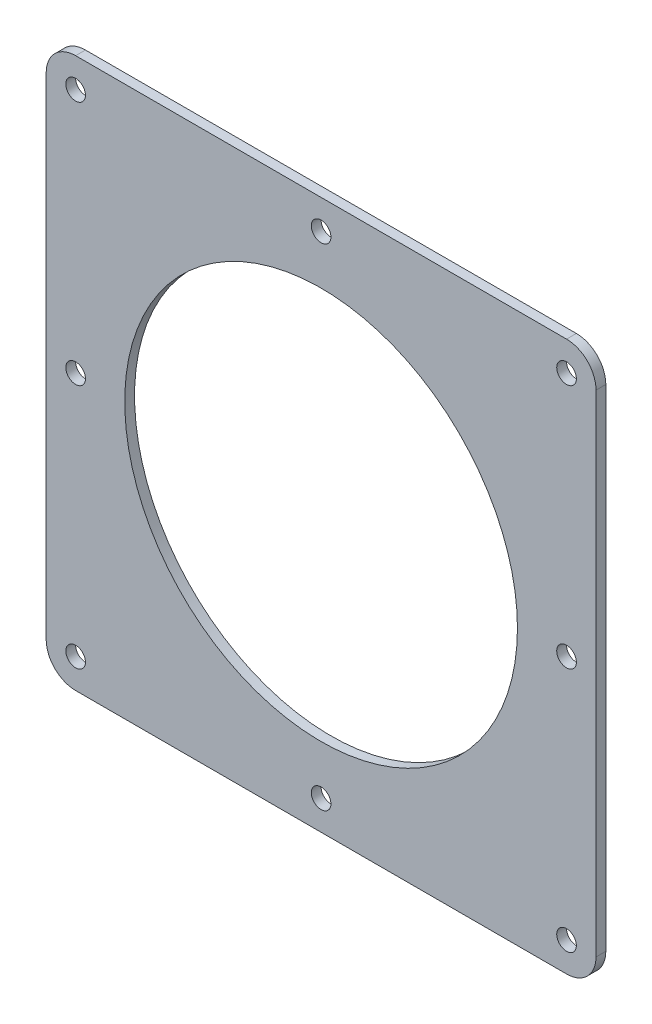
ISO-10303-21;
HEADER;
FILE_DESCRIPTION(('STEP AP214'),'2;1');
FILE_NAME('part.step','',(''),(''),'','','');
FILE_SCHEMA(('AUTOMOTIVE_DESIGN { 1 0 10303 214 1 1 1 1 }'));
ENDSEC;
DATA;
#1=APPLICATION_CONTEXT('core data for automotive mechanical design processes');
#2=APPLICATION_PROTOCOL_DEFINITION('international standard','automotive_design',2000,#1);
#3=PRODUCT_CONTEXT('',#1,'mechanical');
#4=PRODUCT('Part','Part','',(#3));
#5=PRODUCT_RELATED_PRODUCT_CATEGORY('part','',(#4));
#6=PRODUCT_DEFINITION_FORMATION('','',#4);
#7=PRODUCT_DEFINITION_CONTEXT('part definition',#1,'design');
#8=PRODUCT_DEFINITION('design','',#6,#7);
#9=PRODUCT_DEFINITION_SHAPE('','',#8);
#10=(LENGTH_UNIT() NAMED_UNIT(*) SI_UNIT(.MILLI.,.METRE.));
#11=(NAMED_UNIT(*) PLANE_ANGLE_UNIT() SI_UNIT($,.RADIAN.));
#12=(NAMED_UNIT(*) SI_UNIT($,.STERADIAN.) SOLID_ANGLE_UNIT());
#13=UNCERTAINTY_MEASURE_WITH_UNIT(LENGTH_MEASURE(1.E-05),#10,'distance_accuracy_value','');
#14=(GEOMETRIC_REPRESENTATION_CONTEXT(3) GLOBAL_UNCERTAINTY_ASSIGNED_CONTEXT((#13)) GLOBAL_UNIT_ASSIGNED_CONTEXT((#10,
#11,#12)) REPRESENTATION_CONTEXT('',''));
#15=CARTESIAN_POINT('',(0.,0.,0.));
#16=DIRECTION('',(0.,0.,1.));
#17=DIRECTION('',(1.,0.,0.));
#18=AXIS2_PLACEMENT_3D('',#15,#16,#17);
#19=CARTESIAN_POINT('',(-125.,-125.,5.));
#20=DIRECTION('',(0.,0.,1.));
#21=DIRECTION('',(1.,0.,0.));
#22=AXIS2_PLACEMENT_3D('',#19,#20,#21);
#23=PLANE('',#22);
#24=CARTESIAN_POINT('',(0.,0.,5.));
#25=DIRECTION('',(0.,0.,1.));
#26=DIRECTION('',(1.,0.,0.));
#27=AXIS2_PLACEMENT_3D('',#24,#25,#26);
#28=CIRCLE('',#27,100.);
#29=CARTESIAN_POINT('',(100.,0.,5.));
#30=VERTEX_POINT('',#29);
#31=EDGE_CURVE('E228',#30,#30,#28,.T.);
#32=ORIENTED_EDGE('',*,*,#31,.F.);
#33=EDGE_LOOP('',(#32));
#34=FACE_BOUND('',#33,.T.);
#35=CARTESIAN_POINT('',(0.,-125.,5.));
#36=DIRECTION('',(0.,0.,1.));
#37=DIRECTION('',(1.,0.,0.));
#38=AXIS2_PLACEMENT_3D('',#35,#36,#37);
#39=CIRCLE('',#38,5.);
#40=CARTESIAN_POINT('',(5.,-125.,5.));
#41=VERTEX_POINT('',#40);
#42=EDGE_CURVE('E214',#41,#41,#39,.T.);
#43=ORIENTED_EDGE('',*,*,#42,.F.);
#44=EDGE_LOOP('',(#43));
#45=FACE_BOUND('',#44,.T.);
#46=CARTESIAN_POINT('',(125.,0.,5.));
#47=DIRECTION('',(0.,0.,1.));
#48=DIRECTION('',(1.,0.,0.));
#49=AXIS2_PLACEMENT_3D('',#46,#47,#48);
#50=CIRCLE('',#49,5.00000000000001);
#51=CARTESIAN_POINT('',(130.,0.,5.));
#52=VERTEX_POINT('',#51);
#53=EDGE_CURVE('E196',#52,#52,#50,.T.);
#54=ORIENTED_EDGE('',*,*,#53,.F.);
#55=EDGE_LOOP('',(#54));
#56=FACE_BOUND('',#55,.T.);
#57=CARTESIAN_POINT('',(0.,125.,5.));
#58=DIRECTION('',(0.,0.,1.));
#59=DIRECTION('',(1.,0.,0.));
#60=AXIS2_PLACEMENT_3D('',#57,#58,#59);
#61=CIRCLE('',#60,5.);
#62=CARTESIAN_POINT('',(4.99999999999999,125.,5.));
#63=VERTEX_POINT('',#62);
#64=EDGE_CURVE('E184',#63,#63,#61,.T.);
#65=ORIENTED_EDGE('',*,*,#64,.F.);
#66=EDGE_LOOP('',(#65));
#67=FACE_BOUND('',#66,.T.);
#68=CARTESIAN_POINT('',(-125.,-125.,5.));
#69=DIRECTION('',(0.,0.,1.));
#70=DIRECTION('',(1.,0.,0.));
#71=AXIS2_PLACEMENT_3D('',#68,#69,#70);
#72=CIRCLE('',#71,15.);
#73=CARTESIAN_POINT('',(-140.,-125.,5.));
#74=VERTEX_POINT('',#73);
#75=CARTESIAN_POINT('',(-125.,-140.,5.));
#76=VERTEX_POINT('',#75);
#77=EDGE_CURVE('E146',#74,#76,#72,.T.);
#78=ORIENTED_EDGE('',*,*,#77,.T.);
#79=DIRECTION('',(1.,0.,0.));
#80=VECTOR('',#79,1.);
#81=CARTESIAN_POINT('',(-125.,-140.,5.));
#82=LINE('',#81,#80);
#83=CARTESIAN_POINT('',(125.,-140.,5.));
#84=VERTEX_POINT('',#83);
#85=EDGE_CURVE('E94',#76,#84,#82,.T.);
#86=ORIENTED_EDGE('',*,*,#85,.T.);
#87=CARTESIAN_POINT('',(125.,-125.,5.));
#88=DIRECTION('',(0.,0.,1.));
#89=DIRECTION('',(1.,0.,0.));
#90=AXIS2_PLACEMENT_3D('',#87,#88,#89);
#91=CIRCLE('',#90,15.);
#92=CARTESIAN_POINT('',(140.,-125.,5.));
#93=VERTEX_POINT('',#92);
#94=EDGE_CURVE('E162',#84,#93,#91,.T.);
#95=ORIENTED_EDGE('',*,*,#94,.T.);
#96=DIRECTION('',(0.,1.,0.));
#97=VECTOR('',#96,1.);
#98=CARTESIAN_POINT('',(140.,125.,5.));
#99=LINE('',#98,#97);
#100=CARTESIAN_POINT('',(140.,125.,5.));
#101=VERTEX_POINT('',#100);
#102=EDGE_CURVE('E175',#93,#101,#99,.T.);
#103=ORIENTED_EDGE('',*,*,#102,.T.);
#104=CARTESIAN_POINT('',(125.,125.,5.));
#105=DIRECTION('',(0.,0.,1.));
#106=DIRECTION('',(-1.,0.,0.));
#107=AXIS2_PLACEMENT_3D('',#104,#105,#106);
#108=CIRCLE('',#107,15.);
#109=CARTESIAN_POINT('',(125.,140.,5.));
#110=VERTEX_POINT('',#109);
#111=EDGE_CURVE('E113',#101,#110,#108,.T.);
#112=ORIENTED_EDGE('',*,*,#111,.T.);
#113=DIRECTION('',(-1.,0.,0.));
#114=VECTOR('',#113,1.);
#115=CARTESIAN_POINT('',(-125.,140.,5.));
#116=LINE('',#115,#114);
#117=CARTESIAN_POINT('',(-125.,140.,5.));
#118=VERTEX_POINT('',#117);
#119=EDGE_CURVE('E107',#110,#118,#116,.T.);
#120=ORIENTED_EDGE('',*,*,#119,.T.);
#121=CARTESIAN_POINT('',(-125.,125.,5.));
#122=DIRECTION('',(0.,0.,1.));
#123=DIRECTION('',(1.,0.,0.));
#124=AXIS2_PLACEMENT_3D('',#121,#122,#123);
#125=CIRCLE('',#124,15.);
#126=CARTESIAN_POINT('',(-140.,125.,5.));
#127=VERTEX_POINT('',#126);
#128=EDGE_CURVE('E111',#118,#127,#125,.T.);
#129=ORIENTED_EDGE('',*,*,#128,.T.);
#130=DIRECTION('',(0.,-1.,0.));
#131=VECTOR('',#130,1.);
#132=CARTESIAN_POINT('',(-140.,125.,5.));
#133=LINE('',#132,#131);
#134=EDGE_CURVE('E51',#127,#74,#133,.T.);
#135=ORIENTED_EDGE('',*,*,#134,.T.);
#136=EDGE_LOOP('',(#78,#86,#95,#103,#112,#120,#129,#135));
#137=FACE_BOUND('',#136,.T.);
#138=CARTESIAN_POINT('',(-125.,125.,5.));
#139=DIRECTION('',(0.,0.,1.));
#140=DIRECTION('',(1.,0.,0.));
#141=AXIS2_PLACEMENT_3D('',#138,#139,#140);
#142=CIRCLE('',#141,5.00000000000001);
#143=CARTESIAN_POINT('',(-120.,125.,5.));
#144=VERTEX_POINT('',#143);
#145=EDGE_CURVE('E135',#144,#144,#142,.T.);
#146=ORIENTED_EDGE('',*,*,#145,.F.);
#147=EDGE_LOOP('',(#146));
#148=FACE_BOUND('',#147,.T.);
#149=CARTESIAN_POINT('',(125.,125.,5.));
#150=DIRECTION('',(0.,0.,1.));
#151=DIRECTION('',(1.,0.,0.));
#152=AXIS2_PLACEMENT_3D('',#149,#150,#151);
#153=CIRCLE('',#152,4.99999999999999);
#154=CARTESIAN_POINT('',(130.,125.,5.));
#155=VERTEX_POINT('',#154);
#156=EDGE_CURVE('E190',#155,#155,#153,.T.);
#157=ORIENTED_EDGE('',*,*,#156,.F.);
#158=EDGE_LOOP('',(#157));
#159=FACE_BOUND('',#158,.T.);
#160=CARTESIAN_POINT('',(-125.,0.,5.));
#161=DIRECTION('',(0.,0.,1.));
#162=DIRECTION('',(1.,0.,0.));
#163=AXIS2_PLACEMENT_3D('',#160,#161,#162);
#164=CIRCLE('',#163,5.);
#165=CARTESIAN_POINT('',(-120.,0.,5.));
#166=VERTEX_POINT('',#165);
#167=EDGE_CURVE('E202',#166,#166,#164,.T.);
#168=ORIENTED_EDGE('',*,*,#167,.F.);
#169=EDGE_LOOP('',(#168));
#170=FACE_BOUND('',#169,.T.);
#171=CARTESIAN_POINT('',(-125.,-125.,5.));
#172=DIRECTION('',(0.,0.,1.));
#173=DIRECTION('',(1.,0.,0.));
#174=AXIS2_PLACEMENT_3D('',#171,#172,#173);
#175=CIRCLE('',#174,5.00000000000001);
#176=CARTESIAN_POINT('',(-120.,-125.,5.));
#177=VERTEX_POINT('',#176);
#178=EDGE_CURVE('E208',#177,#177,#175,.T.);
#179=ORIENTED_EDGE('',*,*,#178,.F.);
#180=EDGE_LOOP('',(#179));
#181=FACE_BOUND('',#180,.T.);
#182=CARTESIAN_POINT('',(125.,-125.,5.));
#183=DIRECTION('',(0.,0.,1.));
#184=DIRECTION('',(1.,0.,0.));
#185=AXIS2_PLACEMENT_3D('',#182,#183,#184);
#186=CIRCLE('',#185,5.00000000000002);
#187=CARTESIAN_POINT('',(130.,-125.,5.));
#188=VERTEX_POINT('',#187);
#189=EDGE_CURVE('E220',#188,#188,#186,.T.);
#190=ORIENTED_EDGE('',*,*,#189,.F.);
#191=EDGE_LOOP('',(#190));
#192=FACE_BOUND('',#191,.T.);
#193=ADVANCED_FACE('F33',(#34,#45,#56,#67,#137,#148,#159,#170,#181,#192),#23,.T.);
#194=CARTESIAN_POINT('',(-125.,-125.,0.));
#195=DIRECTION('',(0.,0.,1.));
#196=DIRECTION('',(1.,0.,0.));
#197=AXIS2_PLACEMENT_3D('',#194,#195,#196);
#198=PLANE('',#197);
#199=CARTESIAN_POINT('',(0.,0.,0.));
#200=DIRECTION('',(0.,0.,1.));
#201=DIRECTION('',(1.,0.,0.));
#202=AXIS2_PLACEMENT_3D('',#199,#200,#201);
#203=CIRCLE('',#202,100.);
#204=CARTESIAN_POINT('',(100.,0.,0.));
#205=VERTEX_POINT('',#204);
#206=EDGE_CURVE('E37',#205,#205,#203,.T.);
#207=ORIENTED_EDGE('',*,*,#206,.T.);
#208=EDGE_LOOP('',(#207));
#209=FACE_BOUND('',#208,.T.);
#210=CARTESIAN_POINT('',(-125.,-125.,0.));
#211=DIRECTION('',(0.,0.,1.));
#212=DIRECTION('',(1.,0.,0.));
#213=AXIS2_PLACEMENT_3D('',#210,#211,#212);
#214=CIRCLE('',#213,15.);
#215=CARTESIAN_POINT('',(-140.,-125.,0.));
#216=VERTEX_POINT('',#215);
#217=CARTESIAN_POINT('',(-125.,-140.,0.));
#218=VERTEX_POINT('',#217);
#219=EDGE_CURVE('E131',#216,#218,#214,.T.);
#220=ORIENTED_EDGE('',*,*,#219,.F.);
#221=DIRECTION('',(0.,-1.,0.));
#222=VECTOR('',#221,1.);
#223=CARTESIAN_POINT('',(-140.,125.,0.));
#224=LINE('',#223,#222);
#225=CARTESIAN_POINT('',(-140.,125.,0.));
#226=VERTEX_POINT('',#225);
#227=EDGE_CURVE('E86',#226,#216,#224,.T.);
#228=ORIENTED_EDGE('',*,*,#227,.F.);
#229=CARTESIAN_POINT('',(-125.,125.,0.));
#230=DIRECTION('',(0.,0.,1.));
#231=DIRECTION('',(1.,0.,0.));
#232=AXIS2_PLACEMENT_3D('',#229,#230,#231);
#233=CIRCLE('',#232,15.);
#234=CARTESIAN_POINT('',(-125.,140.,0.));
#235=VERTEX_POINT('',#234);
#236=EDGE_CURVE('E80',#235,#226,#233,.T.);
#237=ORIENTED_EDGE('',*,*,#236,.F.);
#238=DIRECTION('',(-1.,0.,0.));
#239=VECTOR('',#238,1.);
#240=CARTESIAN_POINT('',(-125.,140.,0.));
#241=LINE('',#240,#239);
#242=CARTESIAN_POINT('',(125.,140.,0.));
#243=VERTEX_POINT('',#242);
#244=EDGE_CURVE('E121',#243,#235,#241,.T.);
#245=ORIENTED_EDGE('',*,*,#244,.F.);
#246=CARTESIAN_POINT('',(125.,125.,0.));
#247=DIRECTION('',(0.,0.,1.));
#248=DIRECTION('',(-1.,0.,0.));
#249=AXIS2_PLACEMENT_3D('',#246,#247,#248);
#250=CIRCLE('',#249,15.);
#251=CARTESIAN_POINT('',(140.,125.,0.));
#252=VERTEX_POINT('',#251);
#253=EDGE_CURVE('E141',#252,#243,#250,.T.);
#254=ORIENTED_EDGE('',*,*,#253,.F.);
#255=DIRECTION('',(0.,1.,0.));
#256=VECTOR('',#255,1.);
#257=CARTESIAN_POINT('',(140.,125.,0.));
#258=LINE('',#257,#256);
#259=CARTESIAN_POINT('',(140.,-125.,0.));
#260=VERTEX_POINT('',#259);
#261=EDGE_CURVE('E139',#260,#252,#258,.T.);
#262=ORIENTED_EDGE('',*,*,#261,.F.);
#263=CARTESIAN_POINT('',(125.,-125.,0.));
#264=DIRECTION('',(0.,0.,1.));
#265=DIRECTION('',(1.,0.,0.));
#266=AXIS2_PLACEMENT_3D('',#263,#264,#265);
#267=CIRCLE('',#266,15.);
#268=CARTESIAN_POINT('',(125.,-140.,0.));
#269=VERTEX_POINT('',#268);
#270=EDGE_CURVE('E137',#269,#260,#267,.T.);
#271=ORIENTED_EDGE('',*,*,#270,.F.);
#272=DIRECTION('',(1.,0.,0.));
#273=VECTOR('',#272,1.);
#274=CARTESIAN_POINT('',(-125.,-140.,0.));
#275=LINE('',#274,#273);
#276=EDGE_CURVE('E134',#218,#269,#275,.T.);
#277=ORIENTED_EDGE('',*,*,#276,.F.);
#278=EDGE_LOOP('',(#220,#228,#237,#245,#254,#262,#271,#277));
#279=FACE_BOUND('',#278,.T.);
#280=CARTESIAN_POINT('',(-125.,125.,0.));
#281=DIRECTION('',(0.,0.,1.));
#282=DIRECTION('',(1.,0.,0.));
#283=AXIS2_PLACEMENT_3D('',#280,#281,#282);
#284=CIRCLE('',#283,5.00000000000001);
#285=CARTESIAN_POINT('',(-120.,125.,0.));
#286=VERTEX_POINT('',#285);
#287=EDGE_CURVE('E181',#286,#286,#284,.T.);
#288=ORIENTED_EDGE('',*,*,#287,.T.);
#289=EDGE_LOOP('',(#288));
#290=FACE_BOUND('',#289,.T.);
#291=CARTESIAN_POINT('',(0.,125.,0.));
#292=DIRECTION('',(0.,0.,1.));
#293=DIRECTION('',(1.,0.,0.));
#294=AXIS2_PLACEMENT_3D('',#291,#292,#293);
#295=CIRCLE('',#294,5.);
#296=CARTESIAN_POINT('',(4.99999999999999,125.,0.));
#297=VERTEX_POINT('',#296);
#298=EDGE_CURVE('E187',#297,#297,#295,.T.);
#299=ORIENTED_EDGE('',*,*,#298,.T.);
#300=EDGE_LOOP('',(#299));
#301=FACE_BOUND('',#300,.T.);
#302=CARTESIAN_POINT('',(125.,125.,0.));
#303=DIRECTION('',(0.,0.,1.));
#304=DIRECTION('',(1.,0.,0.));
#305=AXIS2_PLACEMENT_3D('',#302,#303,#304);
#306=CIRCLE('',#305,4.99999999999999);
#307=CARTESIAN_POINT('',(130.,125.,0.));
#308=VERTEX_POINT('',#307);
#309=EDGE_CURVE('E193',#308,#308,#306,.T.);
#310=ORIENTED_EDGE('',*,*,#309,.T.);
#311=EDGE_LOOP('',(#310));
#312=FACE_BOUND('',#311,.T.);
#313=CARTESIAN_POINT('',(125.,0.,0.));
#314=DIRECTION('',(0.,0.,1.));
#315=DIRECTION('',(1.,0.,0.));
#316=AXIS2_PLACEMENT_3D('',#313,#314,#315);
#317=CIRCLE('',#316,5.00000000000001);
#318=CARTESIAN_POINT('',(130.,0.,0.));
#319=VERTEX_POINT('',#318);
#320=EDGE_CURVE('E199',#319,#319,#317,.T.);
#321=ORIENTED_EDGE('',*,*,#320,.T.);
#322=EDGE_LOOP('',(#321));
#323=FACE_BOUND('',#322,.T.);
#324=CARTESIAN_POINT('',(-125.,0.,0.));
#325=DIRECTION('',(0.,0.,1.));
#326=DIRECTION('',(1.,0.,0.));
#327=AXIS2_PLACEMENT_3D('',#324,#325,#326);
#328=CIRCLE('',#327,5.);
#329=CARTESIAN_POINT('',(-120.,0.,0.));
#330=VERTEX_POINT('',#329);
#331=EDGE_CURVE('E205',#330,#330,#328,.T.);
#332=ORIENTED_EDGE('',*,*,#331,.T.);
#333=EDGE_LOOP('',(#332));
#334=FACE_BOUND('',#333,.T.);
#335=CARTESIAN_POINT('',(-125.,-125.,0.));
#336=DIRECTION('',(0.,0.,1.));
#337=DIRECTION('',(1.,0.,0.));
#338=AXIS2_PLACEMENT_3D('',#335,#336,#337);
#339=CIRCLE('',#338,5.00000000000001);
#340=CARTESIAN_POINT('',(-120.,-125.,0.));
#341=VERTEX_POINT('',#340);
#342=EDGE_CURVE('E211',#341,#341,#339,.T.);
#343=ORIENTED_EDGE('',*,*,#342,.T.);
#344=EDGE_LOOP('',(#343));
#345=FACE_BOUND('',#344,.T.);
#346=CARTESIAN_POINT('',(0.,-125.,0.));
#347=DIRECTION('',(0.,0.,1.));
#348=DIRECTION('',(1.,0.,0.));
#349=AXIS2_PLACEMENT_3D('',#346,#347,#348);
#350=CIRCLE('',#349,5.);
#351=CARTESIAN_POINT('',(5.,-125.,0.));
#352=VERTEX_POINT('',#351);
#353=EDGE_CURVE('E217',#352,#352,#350,.T.);
#354=ORIENTED_EDGE('',*,*,#353,.T.);
#355=EDGE_LOOP('',(#354));
#356=FACE_BOUND('',#355,.T.);
#357=CARTESIAN_POINT('',(125.,-125.,0.));
#358=DIRECTION('',(0.,0.,1.));
#359=DIRECTION('',(1.,0.,0.));
#360=AXIS2_PLACEMENT_3D('',#357,#358,#359);
#361=CIRCLE('',#360,5.00000000000002);
#362=CARTESIAN_POINT('',(130.,-125.,0.));
#363=VERTEX_POINT('',#362);
#364=EDGE_CURVE('E223',#363,#363,#361,.T.);
#365=ORIENTED_EDGE('',*,*,#364,.T.);
#366=EDGE_LOOP('',(#365));
#367=FACE_BOUND('',#366,.T.);
#368=ADVANCED_FACE('F166',(#209,#279,#290,#301,#312,#323,#334,#345,#356,#367),#198,.F.);
#369=CARTESIAN_POINT('',(-125.,-125.,5.));
#370=DIRECTION('',(0.,0.,-1.));
#371=DIRECTION('',(-1.,0.,0.));
#372=AXIS2_PLACEMENT_3D('',#369,#370,#371);
#373=CYLINDRICAL_SURFACE('',#372,15.);
#374=ORIENTED_EDGE('',*,*,#219,.T.);
#375=DIRECTION('',(0.,0.,-1.));
#376=VECTOR('',#375,1.);
#377=CARTESIAN_POINT('',(-125.,-140.,5.));
#378=LINE('',#377,#376);
#379=EDGE_CURVE('E11',#76,#218,#378,.T.);
#380=ORIENTED_EDGE('',*,*,#379,.F.);
#381=ORIENTED_EDGE('',*,*,#77,.F.);
#382=DIRECTION('',(0.,0.,-1.));
#383=VECTOR('',#382,1.);
#384=CARTESIAN_POINT('',(-140.,-125.,5.));
#385=LINE('',#384,#383);
#386=EDGE_CURVE('E127',#74,#216,#385,.T.);
#387=ORIENTED_EDGE('',*,*,#386,.T.);
#388=EDGE_LOOP('',(#374,#380,#381,#387));
#389=FACE_BOUND('',#388,.T.);
#390=ADVANCED_FACE('F35',(#389),#373,.T.);
#391=CARTESIAN_POINT('',(-125.,-140.,5.));
#392=DIRECTION('',(0.,1.,0.));
#393=DIRECTION('',(0.,0.,1.));
#394=AXIS2_PLACEMENT_3D('',#391,#392,#393);
#395=PLANE('',#394);
#396=ORIENTED_EDGE('',*,*,#276,.T.);
#397=DIRECTION('',(0.,0.,-1.));
#398=VECTOR('',#397,1.);
#399=CARTESIAN_POINT('',(125.,-140.,5.));
#400=LINE('',#399,#398);
#401=EDGE_CURVE('E43',#84,#269,#400,.T.);
#402=ORIENTED_EDGE('',*,*,#401,.F.);
#403=ORIENTED_EDGE('',*,*,#85,.F.);
#404=ORIENTED_EDGE('',*,*,#379,.T.);
#405=EDGE_LOOP('',(#396,#402,#403,#404));
#406=FACE_BOUND('',#405,.T.);
#407=ADVANCED_FACE('F270',(#406),#395,.F.);
#408=CARTESIAN_POINT('',(125.,-125.,5.));
#409=DIRECTION('',(0.,0.,-1.));
#410=DIRECTION('',(-1.,0.,0.));
#411=AXIS2_PLACEMENT_3D('',#408,#409,#410);
#412=CYLINDRICAL_SURFACE('',#411,15.);
#413=ORIENTED_EDGE('',*,*,#270,.T.);
#414=DIRECTION('',(0.,0.,-1.));
#415=VECTOR('',#414,1.);
#416=CARTESIAN_POINT('',(140.,-125.,5.));
#417=LINE('',#416,#415);
#418=EDGE_CURVE('E153',#93,#260,#417,.T.);
#419=ORIENTED_EDGE('',*,*,#418,.F.);
#420=ORIENTED_EDGE('',*,*,#94,.F.);
#421=ORIENTED_EDGE('',*,*,#401,.T.);
#422=EDGE_LOOP('',(#413,#419,#420,#421));
#423=FACE_BOUND('',#422,.T.);
#424=ADVANCED_FACE('F160',(#423),#412,.T.);
#425=CARTESIAN_POINT('',(140.,125.,5.));
#426=DIRECTION('',(-1.,0.,0.));
#427=DIRECTION('',(0.,0.,1.));
#428=AXIS2_PLACEMENT_3D('',#425,#426,#427);
#429=PLANE('',#428);
#430=ORIENTED_EDGE('',*,*,#261,.T.);
#431=DIRECTION('',(0.,0.,-1.));
#432=VECTOR('',#431,1.);
#433=CARTESIAN_POINT('',(140.,125.,5.));
#434=LINE('',#433,#432);
#435=EDGE_CURVE('E150',#101,#252,#434,.T.);
#436=ORIENTED_EDGE('',*,*,#435,.F.);
#437=ORIENTED_EDGE('',*,*,#102,.F.);
#438=ORIENTED_EDGE('',*,*,#418,.T.);
#439=EDGE_LOOP('',(#430,#436,#437,#438));
#440=FACE_BOUND('',#439,.T.);
#441=ADVANCED_FACE('F171',(#440),#429,.F.);
#442=CARTESIAN_POINT('',(125.,125.,5.));
#443=DIRECTION('',(0.,0.,-1.));
#444=DIRECTION('',(-1.,0.,0.));
#445=AXIS2_PLACEMENT_3D('',#442,#443,#444);
#446=CYLINDRICAL_SURFACE('',#445,15.);
#447=ORIENTED_EDGE('',*,*,#253,.T.);
#448=DIRECTION('',(0.,0.,-1.));
#449=VECTOR('',#448,1.);
#450=CARTESIAN_POINT('',(125.,140.,5.));
#451=LINE('',#450,#449);
#452=EDGE_CURVE('E122',#110,#243,#451,.T.);
#453=ORIENTED_EDGE('',*,*,#452,.F.);
#454=ORIENTED_EDGE('',*,*,#111,.F.);
#455=ORIENTED_EDGE('',*,*,#435,.T.);
#456=EDGE_LOOP('',(#447,#453,#454,#455));
#457=FACE_BOUND('',#456,.T.);
#458=ADVANCED_FACE('F174',(#457),#446,.T.);
#459=CARTESIAN_POINT('',(-125.,140.,5.));
#460=DIRECTION('',(0.,-1.,0.));
#461=DIRECTION('',(0.,0.,-1.));
#462=AXIS2_PLACEMENT_3D('',#459,#460,#461);
#463=PLANE('',#462);
#464=ORIENTED_EDGE('',*,*,#244,.T.);
#465=DIRECTION('',(0.,0.,-1.));
#466=VECTOR('',#465,1.);
#467=CARTESIAN_POINT('',(-125.,140.,5.));
#468=LINE('',#467,#466);
#469=EDGE_CURVE('E118',#118,#235,#468,.T.);
#470=ORIENTED_EDGE('',*,*,#469,.F.);
#471=ORIENTED_EDGE('',*,*,#119,.F.);
#472=ORIENTED_EDGE('',*,*,#452,.T.);
#473=EDGE_LOOP('',(#464,#470,#471,#472));
#474=FACE_BOUND('',#473,.T.);
#475=ADVANCED_FACE('F119',(#474),#463,.F.);
#476=CARTESIAN_POINT('',(-125.,125.,5.));
#477=DIRECTION('',(0.,0.,-1.));
#478=DIRECTION('',(-1.,0.,0.));
#479=AXIS2_PLACEMENT_3D('',#476,#477,#478);
#480=CYLINDRICAL_SURFACE('',#479,15.);
#481=ORIENTED_EDGE('',*,*,#236,.T.);
#482=DIRECTION('',(0.,0.,-1.));
#483=VECTOR('',#482,1.);
#484=CARTESIAN_POINT('',(-140.,125.,5.));
#485=LINE('',#484,#483);
#486=EDGE_CURVE('E123',#127,#226,#485,.T.);
#487=ORIENTED_EDGE('',*,*,#486,.F.);
#488=ORIENTED_EDGE('',*,*,#128,.F.);
#489=ORIENTED_EDGE('',*,*,#469,.T.);
#490=EDGE_LOOP('',(#481,#487,#488,#489));
#491=FACE_BOUND('',#490,.T.);
#492=ADVANCED_FACE('F125',(#491),#480,.T.);
#493=CARTESIAN_POINT('',(-140.,125.,5.));
#494=DIRECTION('',(1.,0.,0.));
#495=DIRECTION('',(0.,0.,-1.));
#496=AXIS2_PLACEMENT_3D('',#493,#494,#495);
#497=PLANE('',#496);
#498=ORIENTED_EDGE('',*,*,#227,.T.);
#499=ORIENTED_EDGE('',*,*,#386,.F.);
#500=ORIENTED_EDGE('',*,*,#134,.F.);
#501=ORIENTED_EDGE('',*,*,#486,.T.);
#502=EDGE_LOOP('',(#498,#499,#500,#501));
#503=FACE_BOUND('',#502,.T.);
#504=ADVANCED_FACE('F258',(#503),#497,.F.);
#505=CARTESIAN_POINT('',(-125.,125.,5.));
#506=DIRECTION('',(0.,0.,-1.));
#507=DIRECTION('',(-1.,0.,0.));
#508=AXIS2_PLACEMENT_3D('',#505,#506,#507);
#509=CYLINDRICAL_SURFACE('',#508,5.00000000000001);
#510=ORIENTED_EDGE('',*,*,#145,.T.);
#511=EDGE_LOOP('',(#510));
#512=FACE_BOUND('',#511,.T.);
#513=ORIENTED_EDGE('',*,*,#287,.F.);
#514=EDGE_LOOP('',(#513));
#515=FACE_BOUND('',#514,.T.);
#516=ADVANCED_FACE('F255',(#512,#515),#509,.F.);
#517=CARTESIAN_POINT('',(0.,125.,5.));
#518=DIRECTION('',(0.,0.,-1.));
#519=DIRECTION('',(-1.,0.,0.));
#520=AXIS2_PLACEMENT_3D('',#517,#518,#519);
#521=CYLINDRICAL_SURFACE('',#520,5.);
#522=ORIENTED_EDGE('',*,*,#64,.T.);
#523=EDGE_LOOP('',(#522));
#524=FACE_BOUND('',#523,.T.);
#525=ORIENTED_EDGE('',*,*,#298,.F.);
#526=EDGE_LOOP('',(#525));
#527=FACE_BOUND('',#526,.T.);
#528=ADVANCED_FACE('F341',(#524,#527),#521,.F.);
#529=CARTESIAN_POINT('',(125.,125.,5.));
#530=DIRECTION('',(0.,0.,-1.));
#531=DIRECTION('',(-1.,0.,0.));
#532=AXIS2_PLACEMENT_3D('',#529,#530,#531);
#533=CYLINDRICAL_SURFACE('',#532,4.99999999999999);
#534=ORIENTED_EDGE('',*,*,#156,.T.);
#535=EDGE_LOOP('',(#534));
#536=FACE_BOUND('',#535,.T.);
#537=ORIENTED_EDGE('',*,*,#309,.F.);
#538=EDGE_LOOP('',(#537));
#539=FACE_BOUND('',#538,.T.);
#540=ADVANCED_FACE('F332',(#536,#539),#533,.F.);
#541=CARTESIAN_POINT('',(125.,0.,5.));
#542=DIRECTION('',(0.,0.,-1.));
#543=DIRECTION('',(-1.,0.,0.));
#544=AXIS2_PLACEMENT_3D('',#541,#542,#543);
#545=CYLINDRICAL_SURFACE('',#544,5.00000000000001);
#546=ORIENTED_EDGE('',*,*,#53,.T.);
#547=EDGE_LOOP('',(#546));
#548=FACE_BOUND('',#547,.T.);
#549=ORIENTED_EDGE('',*,*,#320,.F.);
#550=EDGE_LOOP('',(#549));
#551=FACE_BOUND('',#550,.T.);
#552=ADVANCED_FACE('F323',(#548,#551),#545,.F.);
#553=CARTESIAN_POINT('',(-125.,0.,5.));
#554=DIRECTION('',(0.,0.,-1.));
#555=DIRECTION('',(-1.,0.,0.));
#556=AXIS2_PLACEMENT_3D('',#553,#554,#555);
#557=CYLINDRICAL_SURFACE('',#556,5.);
#558=ORIENTED_EDGE('',*,*,#167,.T.);
#559=EDGE_LOOP('',(#558));
#560=FACE_BOUND('',#559,.T.);
#561=ORIENTED_EDGE('',*,*,#331,.F.);
#562=EDGE_LOOP('',(#561));
#563=FACE_BOUND('',#562,.T.);
#564=ADVANCED_FACE('F314',(#560,#563),#557,.F.);
#565=CARTESIAN_POINT('',(-125.,-125.,5.));
#566=DIRECTION('',(0.,0.,-1.));
#567=DIRECTION('',(-1.,0.,0.));
#568=AXIS2_PLACEMENT_3D('',#565,#566,#567);
#569=CYLINDRICAL_SURFACE('',#568,5.00000000000001);
#570=ORIENTED_EDGE('',*,*,#178,.T.);
#571=EDGE_LOOP('',(#570));
#572=FACE_BOUND('',#571,.T.);
#573=ORIENTED_EDGE('',*,*,#342,.F.);
#574=EDGE_LOOP('',(#573));
#575=FACE_BOUND('',#574,.T.);
#576=ADVANCED_FACE('F305',(#572,#575),#569,.F.);
#577=CARTESIAN_POINT('',(0.,-125.,5.));
#578=DIRECTION('',(0.,0.,-1.));
#579=DIRECTION('',(-1.,0.,0.));
#580=AXIS2_PLACEMENT_3D('',#577,#578,#579);
#581=CYLINDRICAL_SURFACE('',#580,5.);
#582=ORIENTED_EDGE('',*,*,#42,.T.);
#583=EDGE_LOOP('',(#582));
#584=FACE_BOUND('',#583,.T.);
#585=ORIENTED_EDGE('',*,*,#353,.F.);
#586=EDGE_LOOP('',(#585));
#587=FACE_BOUND('',#586,.T.);
#588=ADVANCED_FACE('F243',(#584,#587),#581,.F.);
#589=CARTESIAN_POINT('',(125.,-125.,5.));
#590=DIRECTION('',(0.,0.,-1.));
#591=DIRECTION('',(-1.,0.,0.));
#592=AXIS2_PLACEMENT_3D('',#589,#590,#591);
#593=CYLINDRICAL_SURFACE('',#592,5.00000000000002);
#594=ORIENTED_EDGE('',*,*,#189,.T.);
#595=EDGE_LOOP('',(#594));
#596=FACE_BOUND('',#595,.T.);
#597=ORIENTED_EDGE('',*,*,#364,.F.);
#598=EDGE_LOOP('',(#597));
#599=FACE_BOUND('',#598,.T.);
#600=ADVANCED_FACE('F238',(#596,#599),#593,.F.);
#601=CARTESIAN_POINT('',(0.,0.,-5.));
#602=DIRECTION('',(0.,0.,1.));
#603=DIRECTION('',(1.,0.,0.));
#604=AXIS2_PLACEMENT_3D('',#601,#602,#603);
#605=CYLINDRICAL_SURFACE('',#604,100.);
#606=ORIENTED_EDGE('',*,*,#31,.T.);
#607=EDGE_LOOP('',(#606));
#608=FACE_BOUND('',#607,.T.);
#609=ORIENTED_EDGE('',*,*,#206,.F.);
#610=EDGE_LOOP('',(#609));
#611=FACE_BOUND('',#610,.T.);
#612=ADVANCED_FACE('F236',(#608,#611),#605,.F.);
#613=CLOSED_SHELL('',(#193,#368,#390,#407,#424,#441,#458,#475,#492,#504,#516,#528,#540,#552,
#564,#576,#588,#600,#612));
#614=MANIFOLD_SOLID_BREP('B2',#613);
#615=ADVANCED_BREP_SHAPE_REPRESENTATION('',(#18,#614),#14);
#616=SHAPE_DEFINITION_REPRESENTATION(#9,#615);
ENDSEC;
END-ISO-10303-21;
